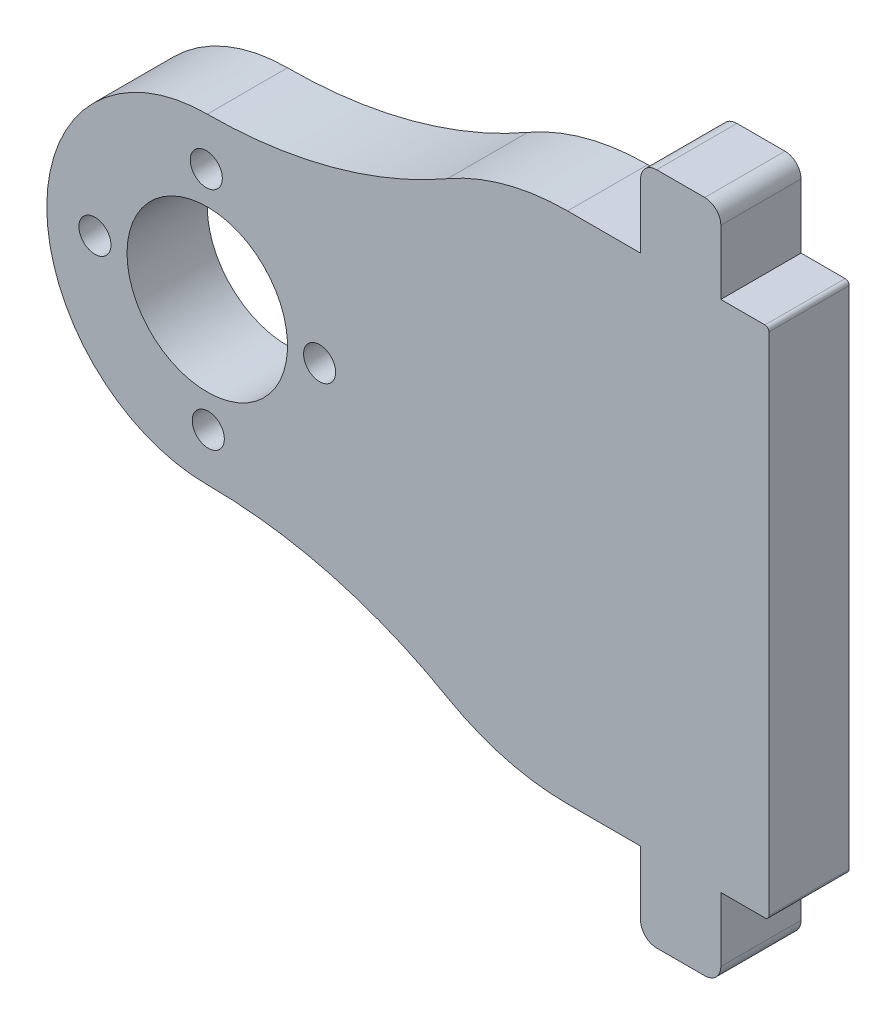
ISO-10303-21;
HEADER;
FILE_DESCRIPTION(('STEP AP214'),'2;1');
FILE_NAME('part.step','',(''),(''),'','','');
FILE_SCHEMA(('AUTOMOTIVE_DESIGN { 1 0 10303 214 1 1 1 1 }'));
ENDSEC;
DATA;
#1=APPLICATION_CONTEXT('core data for automotive mechanical design processes');
#2=APPLICATION_PROTOCOL_DEFINITION('international standard','automotive_design',2000,#1);
#3=PRODUCT_CONTEXT('',#1,'mechanical');
#4=PRODUCT('Part','Part','',(#3));
#5=PRODUCT_RELATED_PRODUCT_CATEGORY('part','',(#4));
#6=PRODUCT_DEFINITION_FORMATION('','',#4);
#7=PRODUCT_DEFINITION_CONTEXT('part definition',#1,'design');
#8=PRODUCT_DEFINITION('design','',#6,#7);
#9=PRODUCT_DEFINITION_SHAPE('','',#8);
#10=(LENGTH_UNIT() NAMED_UNIT(*) SI_UNIT(.MILLI.,.METRE.));
#11=(NAMED_UNIT(*) PLANE_ANGLE_UNIT() SI_UNIT($,.RADIAN.));
#12=(NAMED_UNIT(*) SI_UNIT($,.STERADIAN.) SOLID_ANGLE_UNIT());
#13=UNCERTAINTY_MEASURE_WITH_UNIT(LENGTH_MEASURE(1.E-05),#10,'distance_accuracy_value','');
#14=(GEOMETRIC_REPRESENTATION_CONTEXT(3) GLOBAL_UNCERTAINTY_ASSIGNED_CONTEXT((#13)) GLOBAL_UNIT_ASSIGNED_CONTEXT((#10,
#11,#12)) REPRESENTATION_CONTEXT('',''));
#15=CARTESIAN_POINT('',(0.,0.,0.));
#16=DIRECTION('',(0.,0.,1.));
#17=DIRECTION('',(1.,0.,0.));
#18=AXIS2_PLACEMENT_3D('',#15,#16,#17);
#19=CARTESIAN_POINT('',(-12.5,40.,5.));
#20=DIRECTION('',(0.,0.,1.));
#21=DIRECTION('',(1.,0.,0.));
#22=AXIS2_PLACEMENT_3D('',#19,#20,#21);
#23=PLANE('',#22);
#24=DIRECTION('',(1.,0.,0.));
#25=VECTOR('',#24,1.);
#26=CARTESIAN_POINT('',(19.25,-21.,5.));
#27=LINE('',#26,#25);
#28=CARTESIAN_POINT('',(15.5,-21.,5.));
#29=VERTEX_POINT('',#28);
#30=CARTESIAN_POINT('',(18.5,-21.,5.));
#31=VERTEX_POINT('',#30);
#32=EDGE_CURVE('E261',#29,#31,#27,.T.);
#33=ORIENTED_EDGE('',*,*,#32,.T.);
#34=CARTESIAN_POINT('',(18.5,-20.,5.));
#35=DIRECTION('',(0.,0.,1.));
#36=DIRECTION('',(1.,0.,0.));
#37=AXIS2_PLACEMENT_3D('',#34,#35,#36);
#38=CIRCLE('',#37,1.);
#39=CARTESIAN_POINT('',(19.5,-20.,5.));
#40=VERTEX_POINT('',#39);
#41=EDGE_CURVE('E372',#31,#40,#38,.T.);
#42=ORIENTED_EDGE('',*,*,#41,.T.);
#43=DIRECTION('',(0.,1.,0.));
#44=VECTOR('',#43,1.);
#45=CARTESIAN_POINT('',(19.5,-16.25,5.));
#46=LINE('',#45,#44);
#47=CARTESIAN_POINT('',(19.5,-16.,5.));
#48=VERTEX_POINT('',#47);
#49=EDGE_CURVE('E263',#40,#48,#46,.T.);
#50=ORIENTED_EDGE('',*,*,#49,.T.);
#51=DIRECTION('',(1.,0.,0.));
#52=VECTOR('',#51,1.);
#53=CARTESIAN_POINT('',(22.25,-16.,5.));
#54=LINE('',#53,#52);
#55=CARTESIAN_POINT('',(22.25,-16.,5.));
#56=VERTEX_POINT('',#55);
#57=EDGE_CURVE('E265',#48,#56,#54,.T.);
#58=ORIENTED_EDGE('',*,*,#57,.T.);
#59=CARTESIAN_POINT('',(22.25,-15.75,5.));
#60=DIRECTION('',(0.,0.,1.));
#61=DIRECTION('',(1.,0.,0.));
#62=AXIS2_PLACEMENT_3D('',#59,#60,#61);
#63=CIRCLE('',#62,0.25);
#64=CARTESIAN_POINT('',(22.5,-15.75,5.));
#65=VERTEX_POINT('',#64);
#66=EDGE_CURVE('E267',#56,#65,#63,.T.);
#67=ORIENTED_EDGE('',*,*,#66,.T.);
#68=DIRECTION('',(0.,1.,0.));
#69=VECTOR('',#68,1.);
#70=CARTESIAN_POINT('',(22.5,15.75,5.));
#71=LINE('',#70,#69);
#72=CARTESIAN_POINT('',(22.5,15.75,5.));
#73=VERTEX_POINT('',#72);
#74=EDGE_CURVE('E269',#65,#73,#71,.T.);
#75=ORIENTED_EDGE('',*,*,#74,.T.);
#76=CARTESIAN_POINT('',(22.25,15.75,5.));
#77=DIRECTION('',(0.,0.,1.));
#78=DIRECTION('',(1.,0.,0.));
#79=AXIS2_PLACEMENT_3D('',#76,#77,#78);
#80=CIRCLE('',#79,0.25);
#81=CARTESIAN_POINT('',(22.25,16.,5.));
#82=VERTEX_POINT('',#81);
#83=EDGE_CURVE('E193',#73,#82,#80,.T.);
#84=ORIENTED_EDGE('',*,*,#83,.T.);
#85=DIRECTION('',(-1.,0.,0.));
#86=VECTOR('',#85,1.);
#87=CARTESIAN_POINT('',(19.75,16.,5.));
#88=LINE('',#87,#86);
#89=CARTESIAN_POINT('',(19.5,16.,5.));
#90=VERTEX_POINT('',#89);
#91=EDGE_CURVE('E186',#82,#90,#88,.T.);
#92=ORIENTED_EDGE('',*,*,#91,.T.);
#93=DIRECTION('',(0.,1.,0.));
#94=VECTOR('',#93,1.);
#95=CARTESIAN_POINT('',(19.5,20.75,5.));
#96=LINE('',#95,#94);
#97=CARTESIAN_POINT('',(19.5,20.,5.));
#98=VERTEX_POINT('',#97);
#99=EDGE_CURVE('E190',#90,#98,#96,.T.);
#100=ORIENTED_EDGE('',*,*,#99,.T.);
#101=CARTESIAN_POINT('',(18.5,20.,5.));
#102=DIRECTION('',(0.,0.,1.));
#103=DIRECTION('',(1.,0.,0.));
#104=AXIS2_PLACEMENT_3D('',#101,#102,#103);
#105=CIRCLE('',#104,1.);
#106=CARTESIAN_POINT('',(18.5,21.,5.));
#107=VERTEX_POINT('',#106);
#108=EDGE_CURVE('E368',#98,#107,#105,.T.);
#109=ORIENTED_EDGE('',*,*,#108,.T.);
#110=DIRECTION('',(-1.,0.,0.));
#111=VECTOR('',#110,1.);
#112=CARTESIAN_POINT('',(14.5,21.,5.));
#113=LINE('',#112,#111);
#114=CARTESIAN_POINT('',(15.5,21.,5.));
#115=VERTEX_POINT('',#114);
#116=EDGE_CURVE('E205',#107,#115,#113,.T.);
#117=ORIENTED_EDGE('',*,*,#116,.T.);
#118=CARTESIAN_POINT('',(15.5,20.,5.));
#119=DIRECTION('',(0.,0.,1.));
#120=DIRECTION('',(1.,0.,0.));
#121=AXIS2_PLACEMENT_3D('',#118,#119,#120);
#122=CIRCLE('',#121,1.);
#123=CARTESIAN_POINT('',(14.5,20.,5.));
#124=VERTEX_POINT('',#123);
#125=EDGE_CURVE('E58',#115,#124,#122,.T.);
#126=ORIENTED_EDGE('',*,*,#125,.T.);
#127=DIRECTION('',(0.,-1.,0.));
#128=VECTOR('',#127,1.);
#129=CARTESIAN_POINT('',(14.5,16.,5.));
#130=LINE('',#129,#128);
#131=CARTESIAN_POINT('',(14.5,16.,5.));
#132=VERTEX_POINT('',#131);
#133=EDGE_CURVE('E273',#124,#132,#130,.T.);
#134=ORIENTED_EDGE('',*,*,#133,.T.);
#135=DIRECTION('',(-1.,0.,0.));
#136=VECTOR('',#135,1.);
#137=CARTESIAN_POINT('',(13.4071794233524,16.,5.));
#138=LINE('',#137,#136);
#139=CARTESIAN_POINT('',(9.94994432064366,16.,5.));
#140=VERTEX_POINT('',#139);
#141=EDGE_CURVE('E275',#132,#140,#138,.T.);
#142=ORIENTED_EDGE('',*,*,#141,.T.);
#143=CARTESIAN_POINT('',(9.94994432064366,1.,5.));
#144=DIRECTION('',(0.,0.,1.));
#145=DIRECTION('',(1.,0.,0.));
#146=AXIS2_PLACEMENT_3D('',#143,#144,#145);
#147=CIRCLE('',#146,15.);
#148=CARTESIAN_POINT('',(2.46662954709578,14.,5.));
#149=VERTEX_POINT('',#148);
#150=EDGE_CURVE('E277',#140,#149,#147,.T.);
#151=ORIENTED_EDGE('',*,*,#150,.T.);
#152=CARTESIAN_POINT('',(-12.5,40.,5.));
#153=DIRECTION('',(0.,0.,-1.));
#154=DIRECTION('',(1.,0.,0.));
#155=AXIS2_PLACEMENT_3D('',#152,#153,#154);
#156=CIRCLE('',#155,30.);
#157=CARTESIAN_POINT('',(-12.5,9.99999999999999,5.));
#158=VERTEX_POINT('',#157);
#159=EDGE_CURVE('E247',#149,#158,#156,.T.);
#160=ORIENTED_EDGE('',*,*,#159,.T.);
#161=CARTESIAN_POINT('',(-12.5,0.,5.));
#162=DIRECTION('',(0.,0.,1.));
#163=DIRECTION('',(1.,0.,0.));
#164=AXIS2_PLACEMENT_3D('',#161,#162,#163);
#165=CIRCLE('',#164,10.);
#166=CARTESIAN_POINT('',(-12.5,-10.,5.));
#167=VERTEX_POINT('',#166);
#168=EDGE_CURVE('E250',#158,#167,#165,.T.);
#169=ORIENTED_EDGE('',*,*,#168,.T.);
#170=CARTESIAN_POINT('',(-12.5,-40.,5.));
#171=DIRECTION('',(0.,0.,-1.));
#172=DIRECTION('',(1.,0.,0.));
#173=AXIS2_PLACEMENT_3D('',#170,#171,#172);
#174=CIRCLE('',#173,30.);
#175=CARTESIAN_POINT('',(2.46662954709576,-14.,5.));
#176=VERTEX_POINT('',#175);
#177=EDGE_CURVE('E253',#167,#176,#174,.T.);
#178=ORIENTED_EDGE('',*,*,#177,.T.);
#179=CARTESIAN_POINT('',(9.94994432064363,-0.999999999999999,5.));
#180=DIRECTION('',(0.,0.,1.));
#181=DIRECTION('',(1.,0.,0.));
#182=AXIS2_PLACEMENT_3D('',#179,#180,#181);
#183=CIRCLE('',#182,15.);
#184=CARTESIAN_POINT('',(9.94994432064363,-16.,5.));
#185=VERTEX_POINT('',#184);
#186=EDGE_CURVE('E255',#176,#185,#183,.T.);
#187=ORIENTED_EDGE('',*,*,#186,.T.);
#188=DIRECTION('',(1.,0.,0.));
#189=VECTOR('',#188,1.);
#190=CARTESIAN_POINT('',(13.4071794233524,-16.,5.));
#191=LINE('',#190,#189);
#192=CARTESIAN_POINT('',(14.5,-16.,5.));
#193=VERTEX_POINT('',#192);
#194=EDGE_CURVE('E257',#185,#193,#191,.T.);
#195=ORIENTED_EDGE('',*,*,#194,.T.);
#196=DIRECTION('',(0.,-1.,0.));
#197=VECTOR('',#196,1.);
#198=CARTESIAN_POINT('',(14.5,-21.,5.));
#199=LINE('',#198,#197);
#200=CARTESIAN_POINT('',(14.5,-20.,5.));
#201=VERTEX_POINT('',#200);
#202=EDGE_CURVE('E259',#193,#201,#199,.T.);
#203=ORIENTED_EDGE('',*,*,#202,.T.);
#204=CARTESIAN_POINT('',(15.5,-20.,5.));
#205=DIRECTION('',(0.,0.,1.));
#206=DIRECTION('',(1.,0.,0.));
#207=AXIS2_PLACEMENT_3D('',#204,#205,#206);
#208=CIRCLE('',#207,1.);
#209=EDGE_CURVE('E370',#201,#29,#208,.T.);
#210=ORIENTED_EDGE('',*,*,#209,.T.);
#211=EDGE_LOOP('',(#33,#42,#50,#58,#67,#75,#84,#92,#100,#109,#117,#126,#134,#142,#151,#160,#169,
#178,#187,#195,#203,#210));
#212=FACE_BOUND('',#211,.T.);
#213=CARTESIAN_POINT('',(-12.5,0.,5.));
#214=DIRECTION('',(0.,0.,-1.));
#215=DIRECTION('',(-1.,0.,0.));
#216=AXIS2_PLACEMENT_3D('',#213,#214,#215);
#217=CIRCLE('',#216,5.);
#218=CARTESIAN_POINT('',(-17.5,0.,5.));
#219=VERTEX_POINT('',#218);
#220=EDGE_CURVE('E215',#219,#219,#217,.T.);
#221=ORIENTED_EDGE('',*,*,#220,.T.);
#222=EDGE_LOOP('',(#221));
#223=FACE_BOUND('',#222,.T.);
#224=CARTESIAN_POINT('',(-12.5624545754266,7.,5.));
#225=DIRECTION('',(0.,0.,1.));
#226=DIRECTION('',(1.,0.,0.));
#227=AXIS2_PLACEMENT_3D('',#224,#225,#226);
#228=CIRCLE('',#227,1.);
#229=CARTESIAN_POINT('',(-11.5624545754266,7.,5.));
#230=VERTEX_POINT('',#229);
#231=EDGE_CURVE('E235',#230,#230,#228,.T.);
#232=ORIENTED_EDGE('',*,*,#231,.F.);
#233=EDGE_LOOP('',(#232));
#234=FACE_BOUND('',#233,.T.);
#235=CARTESIAN_POINT('',(-19.5,-0.0624545754265818,5.));
#236=DIRECTION('',(0.,0.,1.));
#237=DIRECTION('',(1.,0.,0.));
#238=AXIS2_PLACEMENT_3D('',#235,#236,#237);
#239=CIRCLE('',#238,0.999999999999998);
#240=CARTESIAN_POINT('',(-18.5,-0.0624545754265818,5.));
#241=VERTEX_POINT('',#240);
#242=EDGE_CURVE('E241',#241,#241,#239,.T.);
#243=ORIENTED_EDGE('',*,*,#242,.F.);
#244=EDGE_LOOP('',(#243));
#245=FACE_BOUND('',#244,.T.);
#246=CARTESIAN_POINT('',(-5.5,0.0624545754265783,5.));
#247=DIRECTION('',(0.,0.,1.));
#248=DIRECTION('',(1.,0.,0.));
#249=AXIS2_PLACEMENT_3D('',#246,#247,#248);
#250=CIRCLE('',#249,1.);
#251=CARTESIAN_POINT('',(-4.5,0.0624545754265783,5.));
#252=VERTEX_POINT('',#251);
#253=EDGE_CURVE('E229',#252,#252,#250,.T.);
#254=ORIENTED_EDGE('',*,*,#253,.F.);
#255=EDGE_LOOP('',(#254));
#256=FACE_BOUND('',#255,.T.);
#257=CARTESIAN_POINT('',(-12.4375454245734,-7.,5.));
#258=DIRECTION('',(0.,0.,1.));
#259=DIRECTION('',(1.,0.,0.));
#260=AXIS2_PLACEMENT_3D('',#257,#258,#259);
#261=CIRCLE('',#260,0.999999999999998);
#262=CARTESIAN_POINT('',(-11.4375454245734,-7.,5.));
#263=VERTEX_POINT('',#262);
#264=EDGE_CURVE('E223',#263,#263,#261,.T.);
#265=ORIENTED_EDGE('',*,*,#264,.F.);
#266=EDGE_LOOP('',(#265));
#267=FACE_BOUND('',#266,.T.);
#268=ADVANCED_FACE('F35',(#212,#223,#234,#245,#256,#267),#23,.T.);
#269=CARTESIAN_POINT('',(-12.5,40.,0.));
#270=DIRECTION('',(0.,0.,1.));
#271=DIRECTION('',(1.,0.,0.));
#272=AXIS2_PLACEMENT_3D('',#269,#270,#271);
#273=PLANE('',#272);
#274=DIRECTION('',(0.,1.,0.));
#275=VECTOR('',#274,1.);
#276=CARTESIAN_POINT('',(19.5,-16.25,0.));
#277=LINE('',#276,#275);
#278=CARTESIAN_POINT('',(19.5,-20.,0.));
#279=VERTEX_POINT('',#278);
#280=CARTESIAN_POINT('',(19.5,-16.,0.));
#281=VERTEX_POINT('',#280);
#282=EDGE_CURVE('E296',#279,#281,#277,.T.);
#283=ORIENTED_EDGE('',*,*,#282,.F.);
#284=CARTESIAN_POINT('',(18.5,-20.,0.));
#285=DIRECTION('',(0.,0.,1.));
#286=DIRECTION('',(1.,0.,0.));
#287=AXIS2_PLACEMENT_3D('',#284,#285,#286);
#288=CIRCLE('',#287,1.);
#289=CARTESIAN_POINT('',(18.5,-21.,0.));
#290=VERTEX_POINT('',#289);
#291=EDGE_CURVE('E360',#279,#290,#288,.F.);
#292=ORIENTED_EDGE('',*,*,#291,.T.);
#293=DIRECTION('',(1.,0.,0.));
#294=VECTOR('',#293,1.);
#295=CARTESIAN_POINT('',(19.25,-21.,0.));
#296=LINE('',#295,#294);
#297=CARTESIAN_POINT('',(15.5,-21.,0.));
#298=VERTEX_POINT('',#297);
#299=EDGE_CURVE('E293',#298,#290,#296,.T.);
#300=ORIENTED_EDGE('',*,*,#299,.F.);
#301=CARTESIAN_POINT('',(15.5,-20.,0.));
#302=DIRECTION('',(0.,0.,1.));
#303=DIRECTION('',(1.,0.,0.));
#304=AXIS2_PLACEMENT_3D('',#301,#302,#303);
#305=CIRCLE('',#304,1.);
#306=CARTESIAN_POINT('',(14.5,-20.,0.));
#307=VERTEX_POINT('',#306);
#308=EDGE_CURVE('E358',#298,#307,#305,.F.);
#309=ORIENTED_EDGE('',*,*,#308,.T.);
#310=DIRECTION('',(0.,-1.,0.));
#311=VECTOR('',#310,1.);
#312=CARTESIAN_POINT('',(14.5,-21.,0.));
#313=LINE('',#312,#311);
#314=CARTESIAN_POINT('',(14.5,-16.,0.));
#315=VERTEX_POINT('',#314);
#316=EDGE_CURVE('E291',#315,#307,#313,.T.);
#317=ORIENTED_EDGE('',*,*,#316,.F.);
#318=DIRECTION('',(1.,0.,0.));
#319=VECTOR('',#318,1.);
#320=CARTESIAN_POINT('',(14.5,-16.,0.));
#321=LINE('',#320,#319);
#322=CARTESIAN_POINT('',(9.94994432064363,-16.,0.));
#323=VERTEX_POINT('',#322);
#324=EDGE_CURVE('E289',#323,#315,#321,.T.);
#325=ORIENTED_EDGE('',*,*,#324,.F.);
#326=CARTESIAN_POINT('',(9.94994432064363,-0.999999999999999,0.));
#327=DIRECTION('',(0.,0.,1.));
#328=DIRECTION('',(1.,0.,0.));
#329=AXIS2_PLACEMENT_3D('',#326,#327,#328);
#330=CIRCLE('',#329,15.);
#331=CARTESIAN_POINT('',(2.46662954709576,-14.,0.));
#332=VERTEX_POINT('',#331);
#333=EDGE_CURVE('E286',#332,#323,#330,.T.);
#334=ORIENTED_EDGE('',*,*,#333,.F.);
#335=CARTESIAN_POINT('',(-12.5,-40.,0.));
#336=DIRECTION('',(0.,0.,-1.));
#337=DIRECTION('',(1.,0.,0.));
#338=AXIS2_PLACEMENT_3D('',#335,#336,#337);
#339=CIRCLE('',#338,30.);
#340=CARTESIAN_POINT('',(-12.5,-10.,0.));
#341=VERTEX_POINT('',#340);
#342=EDGE_CURVE('E284',#341,#332,#339,.T.);
#343=ORIENTED_EDGE('',*,*,#342,.F.);
#344=CARTESIAN_POINT('',(-12.5,0.,0.));
#345=DIRECTION('',(0.,0.,1.));
#346=DIRECTION('',(1.,0.,0.));
#347=AXIS2_PLACEMENT_3D('',#344,#345,#346);
#348=CIRCLE('',#347,10.);
#349=CARTESIAN_POINT('',(-12.5,9.99999999999999,0.));
#350=VERTEX_POINT('',#349);
#351=EDGE_CURVE('E282',#350,#341,#348,.T.);
#352=ORIENTED_EDGE('',*,*,#351,.F.);
#353=CARTESIAN_POINT('',(-12.5,40.,0.));
#354=DIRECTION('',(0.,0.,-1.));
#355=DIRECTION('',(1.,0.,0.));
#356=AXIS2_PLACEMENT_3D('',#353,#354,#355);
#357=CIRCLE('',#356,30.);
#358=CARTESIAN_POINT('',(2.46662954709578,14.,0.));
#359=VERTEX_POINT('',#358);
#360=EDGE_CURVE('E244',#359,#350,#357,.T.);
#361=ORIENTED_EDGE('',*,*,#360,.F.);
#362=CARTESIAN_POINT('',(9.94994432064366,1.,0.));
#363=DIRECTION('',(0.,0.,1.));
#364=DIRECTION('',(1.,0.,0.));
#365=AXIS2_PLACEMENT_3D('',#362,#363,#364);
#366=CIRCLE('',#365,15.);
#367=CARTESIAN_POINT('',(9.94994432064366,16.,0.));
#368=VERTEX_POINT('',#367);
#369=EDGE_CURVE('E251',#368,#359,#366,.T.);
#370=ORIENTED_EDGE('',*,*,#369,.F.);
#371=DIRECTION('',(-1.,0.,0.));
#372=VECTOR('',#371,1.);
#373=CARTESIAN_POINT('',(9.94994432064366,16.,0.));
#374=LINE('',#373,#372);
#375=CARTESIAN_POINT('',(14.5,16.,0.));
#376=VERTEX_POINT('',#375);
#377=EDGE_CURVE('E314',#376,#368,#374,.T.);
#378=ORIENTED_EDGE('',*,*,#377,.F.);
#379=DIRECTION('',(0.,-1.,0.));
#380=VECTOR('',#379,1.);
#381=CARTESIAN_POINT('',(14.5,16.,0.));
#382=LINE('',#381,#380);
#383=CARTESIAN_POINT('',(14.5,20.,0.));
#384=VERTEX_POINT('',#383);
#385=EDGE_CURVE('E312',#384,#376,#382,.T.);
#386=ORIENTED_EDGE('',*,*,#385,.F.);
#387=CARTESIAN_POINT('',(15.5,20.,0.));
#388=DIRECTION('',(0.,0.,1.));
#389=DIRECTION('',(1.,0.,0.));
#390=AXIS2_PLACEMENT_3D('',#387,#388,#389);
#391=CIRCLE('',#390,1.);
#392=CARTESIAN_POINT('',(15.5,21.,0.));
#393=VERTEX_POINT('',#392);
#394=EDGE_CURVE('E354',#384,#393,#391,.F.);
#395=ORIENTED_EDGE('',*,*,#394,.T.);
#396=DIRECTION('',(-1.,0.,0.));
#397=VECTOR('',#396,1.);
#398=CARTESIAN_POINT('',(14.5,21.,0.));
#399=LINE('',#398,#397);
#400=CARTESIAN_POINT('',(18.5,21.,0.));
#401=VERTEX_POINT('',#400);
#402=EDGE_CURVE('E309',#401,#393,#399,.T.);
#403=ORIENTED_EDGE('',*,*,#402,.F.);
#404=CARTESIAN_POINT('',(18.5,20.,0.));
#405=DIRECTION('',(0.,0.,1.));
#406=DIRECTION('',(1.,0.,0.));
#407=AXIS2_PLACEMENT_3D('',#404,#405,#406);
#408=CIRCLE('',#407,1.);
#409=CARTESIAN_POINT('',(19.5,20.,0.));
#410=VERTEX_POINT('',#409);
#411=EDGE_CURVE('E356',#401,#410,#408,.F.);
#412=ORIENTED_EDGE('',*,*,#411,.T.);
#413=DIRECTION('',(0.,1.,0.));
#414=VECTOR('',#413,1.);
#415=CARTESIAN_POINT('',(19.5,20.75,0.));
#416=LINE('',#415,#414);
#417=CARTESIAN_POINT('',(19.5,16.,0.));
#418=VERTEX_POINT('',#417);
#419=EDGE_CURVE('E307',#418,#410,#416,.T.);
#420=ORIENTED_EDGE('',*,*,#419,.F.);
#421=DIRECTION('',(-1.,0.,0.));
#422=VECTOR('',#421,1.);
#423=CARTESIAN_POINT('',(19.75,16.,0.));
#424=LINE('',#423,#422);
#425=CARTESIAN_POINT('',(22.25,16.,0.));
#426=VERTEX_POINT('',#425);
#427=EDGE_CURVE('E209',#426,#418,#424,.T.);
#428=ORIENTED_EDGE('',*,*,#427,.F.);
#429=CARTESIAN_POINT('',(22.25,15.75,0.));
#430=DIRECTION('',(0.,0.,1.));
#431=DIRECTION('',(1.,0.,0.));
#432=AXIS2_PLACEMENT_3D('',#429,#430,#431);
#433=CIRCLE('',#432,0.25);
#434=CARTESIAN_POINT('',(22.5,15.75,0.));
#435=VERTEX_POINT('',#434);
#436=EDGE_CURVE('E304',#435,#426,#433,.T.);
#437=ORIENTED_EDGE('',*,*,#436,.F.);
#438=DIRECTION('',(0.,1.,0.));
#439=VECTOR('',#438,1.);
#440=CARTESIAN_POINT('',(22.5,15.75,0.));
#441=LINE('',#440,#439);
#442=CARTESIAN_POINT('',(22.5,-15.75,0.));
#443=VERTEX_POINT('',#442);
#444=EDGE_CURVE('E302',#443,#435,#441,.T.);
#445=ORIENTED_EDGE('',*,*,#444,.F.);
#446=CARTESIAN_POINT('',(22.25,-15.75,0.));
#447=DIRECTION('',(0.,0.,1.));
#448=DIRECTION('',(1.,0.,0.));
#449=AXIS2_PLACEMENT_3D('',#446,#447,#448);
#450=CIRCLE('',#449,0.25);
#451=CARTESIAN_POINT('',(22.25,-16.,0.));
#452=VERTEX_POINT('',#451);
#453=EDGE_CURVE('E300',#452,#443,#450,.T.);
#454=ORIENTED_EDGE('',*,*,#453,.F.);
#455=DIRECTION('',(1.,0.,0.));
#456=VECTOR('',#455,1.);
#457=CARTESIAN_POINT('',(22.25,-16.,0.));
#458=LINE('',#457,#456);
#459=EDGE_CURVE('E298',#281,#452,#458,.T.);
#460=ORIENTED_EDGE('',*,*,#459,.F.);
#461=EDGE_LOOP('',(#283,#292,#300,#309,#317,#325,#334,#343,#352,#361,#370,#378,#386,#395,#403,
#412,#420,#428,#437,#445,#454,#460));
#462=FACE_BOUND('',#461,.T.);
#463=CARTESIAN_POINT('',(-12.4375454245734,-7.,0.));
#464=DIRECTION('',(0.,0.,1.));
#465=DIRECTION('',(1.,0.,0.));
#466=AXIS2_PLACEMENT_3D('',#463,#464,#465);
#467=CIRCLE('',#466,0.999999999999998);
#468=CARTESIAN_POINT('',(-11.4375454245734,-7.,0.));
#469=VERTEX_POINT('',#468);
#470=EDGE_CURVE('E221',#469,#469,#467,.T.);
#471=ORIENTED_EDGE('',*,*,#470,.T.);
#472=EDGE_LOOP('',(#471));
#473=FACE_BOUND('',#472,.T.);
#474=CARTESIAN_POINT('',(-5.5,0.0624545754265783,0.));
#475=DIRECTION('',(0.,0.,1.));
#476=DIRECTION('',(1.,0.,0.));
#477=AXIS2_PLACEMENT_3D('',#474,#475,#476);
#478=CIRCLE('',#477,1.);
#479=CARTESIAN_POINT('',(-4.5,0.0624545754265783,0.));
#480=VERTEX_POINT('',#479);
#481=EDGE_CURVE('E226',#480,#480,#478,.T.);
#482=ORIENTED_EDGE('',*,*,#481,.T.);
#483=EDGE_LOOP('',(#482));
#484=FACE_BOUND('',#483,.T.);
#485=CARTESIAN_POINT('',(-12.5624545754266,7.,0.));
#486=DIRECTION('',(0.,0.,1.));
#487=DIRECTION('',(1.,0.,0.));
#488=AXIS2_PLACEMENT_3D('',#485,#486,#487);
#489=CIRCLE('',#488,1.);
#490=CARTESIAN_POINT('',(-11.5624545754266,7.,0.));
#491=VERTEX_POINT('',#490);
#492=EDGE_CURVE('E232',#491,#491,#489,.T.);
#493=ORIENTED_EDGE('',*,*,#492,.T.);
#494=EDGE_LOOP('',(#493));
#495=FACE_BOUND('',#494,.T.);
#496=CARTESIAN_POINT('',(-19.5,-0.0624545754265818,0.));
#497=DIRECTION('',(0.,0.,1.));
#498=DIRECTION('',(1.,0.,0.));
#499=AXIS2_PLACEMENT_3D('',#496,#497,#498);
#500=CIRCLE('',#499,0.999999999999998);
#501=CARTESIAN_POINT('',(-18.5,-0.0624545754265818,0.));
#502=VERTEX_POINT('',#501);
#503=EDGE_CURVE('E238',#502,#502,#500,.T.);
#504=ORIENTED_EDGE('',*,*,#503,.T.);
#505=EDGE_LOOP('',(#504));
#506=FACE_BOUND('',#505,.T.);
#507=CARTESIAN_POINT('',(-12.5,0.,0.));
#508=DIRECTION('',(0.,0.,-1.));
#509=DIRECTION('',(-1.,0.,0.));
#510=AXIS2_PLACEMENT_3D('',#507,#508,#509);
#511=CIRCLE('',#510,5.);
#512=CARTESIAN_POINT('',(-17.5,0.,0.));
#513=VERTEX_POINT('',#512);
#514=EDGE_CURVE('E211',#513,#513,#511,.T.);
#515=ORIENTED_EDGE('',*,*,#514,.F.);
#516=EDGE_LOOP('',(#515));
#517=FACE_BOUND('',#516,.T.);
#518=ADVANCED_FACE('F388',(#462,#473,#484,#495,#506,#517),#273,.F.);
#519=CARTESIAN_POINT('',(-12.5,40.,5.));
#520=DIRECTION('',(0.,0.,-1.));
#521=DIRECTION('',(-1.,0.,0.));
#522=AXIS2_PLACEMENT_3D('',#519,#520,#521);
#523=CYLINDRICAL_SURFACE('',#522,30.);
#524=ORIENTED_EDGE('',*,*,#360,.T.);
#525=DIRECTION('',(0.,0.,-1.));
#526=VECTOR('',#525,1.);
#527=CARTESIAN_POINT('',(-12.5,9.99999999999999,5.));
#528=LINE('',#527,#526);
#529=EDGE_CURVE('E348',#158,#350,#528,.T.);
#530=ORIENTED_EDGE('',*,*,#529,.F.);
#531=ORIENTED_EDGE('',*,*,#159,.F.);
#532=DIRECTION('',(0.,0.,-1.));
#533=VECTOR('',#532,1.);
#534=CARTESIAN_POINT('',(2.46662954709578,14.,5.));
#535=LINE('',#534,#533);
#536=EDGE_CURVE('E279',#149,#359,#535,.T.);
#537=ORIENTED_EDGE('',*,*,#536,.T.);
#538=EDGE_LOOP('',(#524,#530,#531,#537));
#539=FACE_BOUND('',#538,.T.);
#540=ADVANCED_FACE('F410',(#539),#523,.F.);
#541=CARTESIAN_POINT('',(-12.5,0.,5.));
#542=DIRECTION('',(0.,0.,-1.));
#543=DIRECTION('',(-1.,0.,0.));
#544=AXIS2_PLACEMENT_3D('',#541,#542,#543);
#545=CYLINDRICAL_SURFACE('',#544,10.);
#546=ORIENTED_EDGE('',*,*,#351,.T.);
#547=DIRECTION('',(0.,0.,-1.));
#548=VECTOR('',#547,1.);
#549=CARTESIAN_POINT('',(-12.5,-10.,5.));
#550=LINE('',#549,#548);
#551=EDGE_CURVE('E345',#167,#341,#550,.T.);
#552=ORIENTED_EDGE('',*,*,#551,.F.);
#553=ORIENTED_EDGE('',*,*,#168,.F.);
#554=ORIENTED_EDGE('',*,*,#529,.T.);
#555=EDGE_LOOP('',(#546,#552,#553,#554));
#556=FACE_BOUND('',#555,.T.);
#557=ADVANCED_FACE('F415',(#556),#545,.T.);
#558=CARTESIAN_POINT('',(-12.5,-40.,5.));
#559=DIRECTION('',(0.,0.,-1.));
#560=DIRECTION('',(-1.,0.,0.));
#561=AXIS2_PLACEMENT_3D('',#558,#559,#560);
#562=CYLINDRICAL_SURFACE('',#561,30.);
#563=ORIENTED_EDGE('',*,*,#342,.T.);
#564=DIRECTION('',(0.,0.,-1.));
#565=VECTOR('',#564,1.);
#566=CARTESIAN_POINT('',(2.46662954709576,-14.,5.));
#567=LINE('',#566,#565);
#568=EDGE_CURVE('E342',#176,#332,#567,.T.);
#569=ORIENTED_EDGE('',*,*,#568,.F.);
#570=ORIENTED_EDGE('',*,*,#177,.F.);
#571=ORIENTED_EDGE('',*,*,#551,.T.);
#572=EDGE_LOOP('',(#563,#569,#570,#571));
#573=FACE_BOUND('',#572,.T.);
#574=ADVANCED_FACE('F418',(#573),#562,.F.);
#575=CARTESIAN_POINT('',(9.94994432064363,-0.999999999999999,5.));
#576=DIRECTION('',(0.,0.,-1.));
#577=DIRECTION('',(-1.,0.,0.));
#578=AXIS2_PLACEMENT_3D('',#575,#576,#577);
#579=CYLINDRICAL_SURFACE('',#578,15.);
#580=ORIENTED_EDGE('',*,*,#333,.T.);
#581=DIRECTION('',(0.,0.,-1.));
#582=VECTOR('',#581,1.);
#583=CARTESIAN_POINT('',(9.94994432064363,-16.,5.));
#584=LINE('',#583,#582);
#585=EDGE_CURVE('E339',#185,#323,#584,.T.);
#586=ORIENTED_EDGE('',*,*,#585,.F.);
#587=ORIENTED_EDGE('',*,*,#186,.F.);
#588=ORIENTED_EDGE('',*,*,#568,.T.);
#589=EDGE_LOOP('',(#580,#586,#587,#588));
#590=FACE_BOUND('',#589,.T.);
#591=ADVANCED_FACE('F423',(#590),#579,.T.);
#592=CARTESIAN_POINT('',(14.5,-16.,5.));
#593=DIRECTION('',(0.,1.,0.));
#594=DIRECTION('',(0.,0.,1.));
#595=AXIS2_PLACEMENT_3D('',#592,#593,#594);
#596=PLANE('',#595);
#597=ORIENTED_EDGE('',*,*,#324,.T.);
#598=DIRECTION('',(0.,0.,-1.));
#599=VECTOR('',#598,1.);
#600=CARTESIAN_POINT('',(14.5,-16.,5.));
#601=LINE('',#600,#599);
#602=EDGE_CURVE('E336',#193,#315,#601,.T.);
#603=ORIENTED_EDGE('',*,*,#602,.F.);
#604=ORIENTED_EDGE('',*,*,#194,.F.);
#605=ORIENTED_EDGE('',*,*,#585,.T.);
#606=EDGE_LOOP('',(#597,#603,#604,#605));
#607=FACE_BOUND('',#606,.T.);
#608=ADVANCED_FACE('F428',(#607),#596,.F.);
#609=CARTESIAN_POINT('',(14.5,-21.,5.));
#610=DIRECTION('',(1.,0.,0.));
#611=DIRECTION('',(0.,0.,-1.));
#612=AXIS2_PLACEMENT_3D('',#609,#610,#611);
#613=PLANE('',#612);
#614=ORIENTED_EDGE('',*,*,#316,.T.);
#615=DIRECTION('',(0.,0.,-1.));
#616=VECTOR('',#615,1.);
#617=CARTESIAN_POINT('',(14.5,-20.,5.));
#618=LINE('',#617,#616);
#619=EDGE_CURVE('E50',#307,#201,#618,.F.);
#620=ORIENTED_EDGE('',*,*,#619,.T.);
#621=ORIENTED_EDGE('',*,*,#202,.F.);
#622=ORIENTED_EDGE('',*,*,#602,.T.);
#623=EDGE_LOOP('',(#614,#620,#621,#622));
#624=FACE_BOUND('',#623,.T.);
#625=ADVANCED_FACE('F430',(#624),#613,.F.);
#626=CARTESIAN_POINT('',(19.25,-21.,5.));
#627=DIRECTION('',(0.,1.,0.));
#628=DIRECTION('',(0.,0.,1.));
#629=AXIS2_PLACEMENT_3D('',#626,#627,#628);
#630=PLANE('',#629);
#631=ORIENTED_EDGE('',*,*,#299,.T.);
#632=DIRECTION('',(0.,0.,-1.));
#633=VECTOR('',#632,1.);
#634=CARTESIAN_POINT('',(18.5,-21.,5.));
#635=LINE('',#634,#633);
#636=EDGE_CURVE('E365',#290,#31,#635,.F.);
#637=ORIENTED_EDGE('',*,*,#636,.T.);
#638=ORIENTED_EDGE('',*,*,#32,.F.);
#639=DIRECTION('',(0.,0.,-1.));
#640=VECTOR('',#639,1.);
#641=CARTESIAN_POINT('',(15.5,-21.,5.));
#642=LINE('',#641,#640);
#643=EDGE_CURVE('E362',#29,#298,#642,.T.);
#644=ORIENTED_EDGE('',*,*,#643,.T.);
#645=EDGE_LOOP('',(#631,#637,#638,#644));
#646=FACE_BOUND('',#645,.T.);
#647=ADVANCED_FACE('F432',(#646),#630,.F.);
#648=CARTESIAN_POINT('',(19.5,-16.25,5.));
#649=DIRECTION('',(-1.,0.,0.));
#650=DIRECTION('',(0.,0.,1.));
#651=AXIS2_PLACEMENT_3D('',#648,#649,#650);
#652=PLANE('',#651);
#653=ORIENTED_EDGE('',*,*,#49,.F.);
#654=DIRECTION('',(0.,0.,-1.));
#655=VECTOR('',#654,1.);
#656=CARTESIAN_POINT('',(19.5,-20.,5.));
#657=LINE('',#656,#655);
#658=EDGE_CURVE('E351',#40,#279,#657,.T.);
#659=ORIENTED_EDGE('',*,*,#658,.T.);
#660=ORIENTED_EDGE('',*,*,#282,.T.);
#661=DIRECTION('',(0.,0.,-1.));
#662=VECTOR('',#661,1.);
#663=CARTESIAN_POINT('',(19.5,-16.,5.));
#664=LINE('',#663,#662);
#665=EDGE_CURVE('E212',#48,#281,#664,.T.);
#666=ORIENTED_EDGE('',*,*,#665,.F.);
#667=EDGE_LOOP('',(#653,#659,#660,#666));
#668=FACE_BOUND('',#667,.T.);
#669=ADVANCED_FACE('F438',(#668),#652,.F.);
#670=CARTESIAN_POINT('',(22.25,-16.,5.));
#671=DIRECTION('',(0.,1.,0.));
#672=DIRECTION('',(0.,0.,1.));
#673=AXIS2_PLACEMENT_3D('',#670,#671,#672);
#674=PLANE('',#673);
#675=ORIENTED_EDGE('',*,*,#459,.T.);
#676=DIRECTION('',(0.,0.,-1.));
#677=VECTOR('',#676,1.);
#678=CARTESIAN_POINT('',(22.25,-16.,5.));
#679=LINE('',#678,#677);
#680=EDGE_CURVE('E333',#56,#452,#679,.T.);
#681=ORIENTED_EDGE('',*,*,#680,.F.);
#682=ORIENTED_EDGE('',*,*,#57,.F.);
#683=ORIENTED_EDGE('',*,*,#665,.T.);
#684=EDGE_LOOP('',(#675,#681,#682,#683));
#685=FACE_BOUND('',#684,.T.);
#686=ADVANCED_FACE('F475',(#685),#674,.F.);
#687=CARTESIAN_POINT('',(22.25,-15.75,5.));
#688=DIRECTION('',(0.,0.,-1.));
#689=DIRECTION('',(-1.,0.,0.));
#690=AXIS2_PLACEMENT_3D('',#687,#688,#689);
#691=CYLINDRICAL_SURFACE('',#690,0.25);
#692=ORIENTED_EDGE('',*,*,#453,.T.);
#693=DIRECTION('',(0.,0.,-1.));
#694=VECTOR('',#693,1.);
#695=CARTESIAN_POINT('',(22.5,-15.75,5.));
#696=LINE('',#695,#694);
#697=EDGE_CURVE('E330',#65,#443,#696,.T.);
#698=ORIENTED_EDGE('',*,*,#697,.F.);
#699=ORIENTED_EDGE('',*,*,#66,.F.);
#700=ORIENTED_EDGE('',*,*,#680,.T.);
#701=EDGE_LOOP('',(#692,#698,#699,#700));
#702=FACE_BOUND('',#701,.T.);
#703=ADVANCED_FACE('F471',(#702),#691,.T.);
#704=CARTESIAN_POINT('',(22.5,15.75,5.));
#705=DIRECTION('',(-1.,0.,0.));
#706=DIRECTION('',(0.,-1.,0.));
#707=AXIS2_PLACEMENT_3D('',#704,#705,#706);
#708=PLANE('',#707);
#709=ORIENTED_EDGE('',*,*,#444,.T.);
#710=DIRECTION('',(0.,0.,-1.));
#711=VECTOR('',#710,1.);
#712=CARTESIAN_POINT('',(22.5,15.75,5.));
#713=LINE('',#712,#711);
#714=EDGE_CURVE('E327',#73,#435,#713,.T.);
#715=ORIENTED_EDGE('',*,*,#714,.F.);
#716=ORIENTED_EDGE('',*,*,#74,.F.);
#717=ORIENTED_EDGE('',*,*,#697,.T.);
#718=EDGE_LOOP('',(#709,#715,#716,#717));
#719=FACE_BOUND('',#718,.T.);
#720=ADVANCED_FACE('F467',(#719),#708,.F.);
#721=CARTESIAN_POINT('',(22.25,15.75,5.));
#722=DIRECTION('',(0.,0.,-1.));
#723=DIRECTION('',(-1.,0.,0.));
#724=AXIS2_PLACEMENT_3D('',#721,#722,#723);
#725=CYLINDRICAL_SURFACE('',#724,0.25);
#726=ORIENTED_EDGE('',*,*,#436,.T.);
#727=DIRECTION('',(0.,0.,-1.));
#728=VECTOR('',#727,1.);
#729=CARTESIAN_POINT('',(22.25,16.,5.));
#730=LINE('',#729,#728);
#731=EDGE_CURVE('E325',#82,#426,#730,.T.);
#732=ORIENTED_EDGE('',*,*,#731,.F.);
#733=ORIENTED_EDGE('',*,*,#83,.F.);
#734=ORIENTED_EDGE('',*,*,#714,.T.);
#735=EDGE_LOOP('',(#726,#732,#733,#734));
#736=FACE_BOUND('',#735,.T.);
#737=ADVANCED_FACE('F464',(#736),#725,.T.);
#738=CARTESIAN_POINT('',(19.75,16.,5.));
#739=DIRECTION('',(0.,-1.,0.));
#740=DIRECTION('',(0.,0.,-1.));
#741=AXIS2_PLACEMENT_3D('',#738,#739,#740);
#742=PLANE('',#741);
#743=ORIENTED_EDGE('',*,*,#427,.T.);
#744=DIRECTION('',(0.,0.,-1.));
#745=VECTOR('',#744,1.);
#746=CARTESIAN_POINT('',(19.5,16.,5.));
#747=LINE('',#746,#745);
#748=EDGE_CURVE('E203',#90,#418,#747,.T.);
#749=ORIENTED_EDGE('',*,*,#748,.F.);
#750=ORIENTED_EDGE('',*,*,#91,.F.);
#751=ORIENTED_EDGE('',*,*,#731,.T.);
#752=EDGE_LOOP('',(#743,#749,#750,#751));
#753=FACE_BOUND('',#752,.T.);
#754=ADVANCED_FACE('F207',(#753),#742,.F.);
#755=CARTESIAN_POINT('',(19.5,20.75,5.));
#756=DIRECTION('',(-1.,0.,0.));
#757=DIRECTION('',(0.,0.,1.));
#758=AXIS2_PLACEMENT_3D('',#755,#756,#757);
#759=PLANE('',#758);
#760=ORIENTED_EDGE('',*,*,#419,.T.);
#761=DIRECTION('',(0.,0.,-1.));
#762=VECTOR('',#761,1.);
#763=CARTESIAN_POINT('',(19.5,20.,5.));
#764=LINE('',#763,#762);
#765=EDGE_CURVE('E43',#410,#98,#764,.F.);
#766=ORIENTED_EDGE('',*,*,#765,.T.);
#767=ORIENTED_EDGE('',*,*,#99,.F.);
#768=ORIENTED_EDGE('',*,*,#748,.T.);
#769=EDGE_LOOP('',(#760,#766,#767,#768));
#770=FACE_BOUND('',#769,.T.);
#771=ADVANCED_FACE('F202',(#770),#759,.F.);
#772=CARTESIAN_POINT('',(14.5,21.,5.));
#773=DIRECTION('',(0.,-1.,0.));
#774=DIRECTION('',(0.,0.,-1.));
#775=AXIS2_PLACEMENT_3D('',#772,#773,#774);
#776=PLANE('',#775);
#777=ORIENTED_EDGE('',*,*,#116,.F.);
#778=DIRECTION('',(0.,0.,-1.));
#779=VECTOR('',#778,1.);
#780=CARTESIAN_POINT('',(18.5,21.,5.));
#781=LINE('',#780,#779);
#782=EDGE_CURVE('E377',#107,#401,#781,.T.);
#783=ORIENTED_EDGE('',*,*,#782,.T.);
#784=ORIENTED_EDGE('',*,*,#402,.T.);
#785=DIRECTION('',(0.,0.,-1.));
#786=VECTOR('',#785,1.);
#787=CARTESIAN_POINT('',(15.5,21.,5.));
#788=LINE('',#787,#786);
#789=EDGE_CURVE('E375',#393,#115,#788,.F.);
#790=ORIENTED_EDGE('',*,*,#789,.T.);
#791=EDGE_LOOP('',(#777,#783,#784,#790));
#792=FACE_BOUND('',#791,.T.);
#793=ADVANCED_FACE('F383',(#792),#776,.F.);
#794=CARTESIAN_POINT('',(14.5,16.,5.));
#795=DIRECTION('',(1.,0.,0.));
#796=DIRECTION('',(0.,0.,-1.));
#797=AXIS2_PLACEMENT_3D('',#794,#795,#796);
#798=PLANE('',#797);
#799=ORIENTED_EDGE('',*,*,#133,.F.);
#800=DIRECTION('',(0.,0.,-1.));
#801=VECTOR('',#800,1.);
#802=CARTESIAN_POINT('',(14.5,20.,5.));
#803=LINE('',#802,#801);
#804=EDGE_CURVE('E11',#124,#384,#803,.T.);
#805=ORIENTED_EDGE('',*,*,#804,.T.);
#806=ORIENTED_EDGE('',*,*,#385,.T.);
#807=DIRECTION('',(0.,0.,-1.));
#808=VECTOR('',#807,1.);
#809=CARTESIAN_POINT('',(14.5,16.,5.));
#810=LINE('',#809,#808);
#811=EDGE_CURVE('E322',#132,#376,#810,.T.);
#812=ORIENTED_EDGE('',*,*,#811,.F.);
#813=EDGE_LOOP('',(#799,#805,#806,#812));
#814=FACE_BOUND('',#813,.T.);
#815=ADVANCED_FACE('F395',(#814),#798,.F.);
#816=CARTESIAN_POINT('',(9.94994432064366,16.,5.));
#817=DIRECTION('',(0.,-1.,0.));
#818=DIRECTION('',(0.,0.,-1.));
#819=AXIS2_PLACEMENT_3D('',#816,#817,#818);
#820=PLANE('',#819);
#821=ORIENTED_EDGE('',*,*,#377,.T.);
#822=DIRECTION('',(0.,0.,-1.));
#823=VECTOR('',#822,1.);
#824=CARTESIAN_POINT('',(9.94994432064366,16.,5.));
#825=LINE('',#824,#823);
#826=EDGE_CURVE('E319',#140,#368,#825,.T.);
#827=ORIENTED_EDGE('',*,*,#826,.F.);
#828=ORIENTED_EDGE('',*,*,#141,.F.);
#829=ORIENTED_EDGE('',*,*,#811,.T.);
#830=EDGE_LOOP('',(#821,#827,#828,#829));
#831=FACE_BOUND('',#830,.T.);
#832=ADVANCED_FACE('F402',(#831),#820,.F.);
#833=CARTESIAN_POINT('',(9.94994432064366,1.,5.));
#834=DIRECTION('',(0.,0.,-1.));
#835=DIRECTION('',(-1.,0.,0.));
#836=AXIS2_PLACEMENT_3D('',#833,#834,#835);
#837=CYLINDRICAL_SURFACE('',#836,15.);
#838=ORIENTED_EDGE('',*,*,#369,.T.);
#839=ORIENTED_EDGE('',*,*,#536,.F.);
#840=ORIENTED_EDGE('',*,*,#150,.F.);
#841=ORIENTED_EDGE('',*,*,#826,.T.);
#842=EDGE_LOOP('',(#838,#839,#840,#841));
#843=FACE_BOUND('',#842,.T.);
#844=ADVANCED_FACE('F405',(#843),#837,.T.);
#845=CARTESIAN_POINT('',(-19.5,-0.0624545754265818,5.));
#846=DIRECTION('',(0.,0.,-1.));
#847=DIRECTION('',(-1.,0.,0.));
#848=AXIS2_PLACEMENT_3D('',#845,#846,#847);
#849=CYLINDRICAL_SURFACE('',#848,0.999999999999998);
#850=ORIENTED_EDGE('',*,*,#242,.T.);
#851=EDGE_LOOP('',(#850));
#852=FACE_BOUND('',#851,.T.);
#853=ORIENTED_EDGE('',*,*,#503,.F.);
#854=EDGE_LOOP('',(#853));
#855=FACE_BOUND('',#854,.T.);
#856=ADVANCED_FACE('F449',(#852,#855),#849,.F.);
#857=CARTESIAN_POINT('',(-12.5624545754266,7.,5.));
#858=DIRECTION('',(0.,0.,-1.));
#859=DIRECTION('',(-1.,0.,0.));
#860=AXIS2_PLACEMENT_3D('',#857,#858,#859);
#861=CYLINDRICAL_SURFACE('',#860,1.);
#862=ORIENTED_EDGE('',*,*,#231,.T.);
#863=EDGE_LOOP('',(#862));
#864=FACE_BOUND('',#863,.T.);
#865=ORIENTED_EDGE('',*,*,#492,.F.);
#866=EDGE_LOOP('',(#865));
#867=FACE_BOUND('',#866,.T.);
#868=ADVANCED_FACE('F567',(#864,#867),#861,.F.);
#869=CARTESIAN_POINT('',(-5.5,0.0624545754265783,5.));
#870=DIRECTION('',(0.,0.,-1.));
#871=DIRECTION('',(-1.,0.,0.));
#872=AXIS2_PLACEMENT_3D('',#869,#870,#871);
#873=CYLINDRICAL_SURFACE('',#872,1.);
#874=ORIENTED_EDGE('',*,*,#253,.T.);
#875=EDGE_LOOP('',(#874));
#876=FACE_BOUND('',#875,.T.);
#877=ORIENTED_EDGE('',*,*,#481,.F.);
#878=EDGE_LOOP('',(#877));
#879=FACE_BOUND('',#878,.T.);
#880=ADVANCED_FACE('F576',(#876,#879),#873,.F.);
#881=CARTESIAN_POINT('',(-12.4375454245734,-7.,5.));
#882=DIRECTION('',(0.,0.,-1.));
#883=DIRECTION('',(-1.,0.,0.));
#884=AXIS2_PLACEMENT_3D('',#881,#882,#883);
#885=CYLINDRICAL_SURFACE('',#884,0.999999999999998);
#886=ORIENTED_EDGE('',*,*,#264,.T.);
#887=EDGE_LOOP('',(#886));
#888=FACE_BOUND('',#887,.T.);
#889=ORIENTED_EDGE('',*,*,#470,.F.);
#890=EDGE_LOOP('',(#889));
#891=FACE_BOUND('',#890,.T.);
#892=ADVANCED_FACE('F585',(#888,#891),#885,.F.);
#893=CARTESIAN_POINT('',(-12.5,0.,5.));
#894=DIRECTION('',(0.,0.,-1.));
#895=DIRECTION('',(-1.,0.,0.));
#896=AXIS2_PLACEMENT_3D('',#893,#894,#895);
#897=CYLINDRICAL_SURFACE('',#896,5.);
#898=ORIENTED_EDGE('',*,*,#220,.F.);
#899=EDGE_LOOP('',(#898));
#900=FACE_BOUND('',#899,.T.);
#901=ORIENTED_EDGE('',*,*,#514,.T.);
#902=EDGE_LOOP('',(#901));
#903=FACE_BOUND('',#902,.T.);
#904=ADVANCED_FACE('F505',(#900,#903),#897,.F.);
#905=CARTESIAN_POINT('',(18.5,-20.,5.));
#906=DIRECTION('',(0.,0.,-1.));
#907=DIRECTION('',(-1.,0.,0.));
#908=AXIS2_PLACEMENT_3D('',#905,#906,#907);
#909=CYLINDRICAL_SURFACE('',#908,1.);
#910=ORIENTED_EDGE('',*,*,#41,.F.);
#911=ORIENTED_EDGE('',*,*,#636,.F.);
#912=ORIENTED_EDGE('',*,*,#291,.F.);
#913=ORIENTED_EDGE('',*,*,#658,.F.);
#914=EDGE_LOOP('',(#910,#911,#912,#913));
#915=FACE_BOUND('',#914,.T.);
#916=ADVANCED_FACE('F490',(#915),#909,.T.);
#917=CARTESIAN_POINT('',(15.5,-20.,5.));
#918=DIRECTION('',(0.,0.,-1.));
#919=DIRECTION('',(-1.,0.,0.));
#920=AXIS2_PLACEMENT_3D('',#917,#918,#919);
#921=CYLINDRICAL_SURFACE('',#920,1.);
#922=ORIENTED_EDGE('',*,*,#209,.F.);
#923=ORIENTED_EDGE('',*,*,#619,.F.);
#924=ORIENTED_EDGE('',*,*,#308,.F.);
#925=ORIENTED_EDGE('',*,*,#643,.F.);
#926=EDGE_LOOP('',(#922,#923,#924,#925));
#927=FACE_BOUND('',#926,.T.);
#928=ADVANCED_FACE('F497',(#927),#921,.T.);
#929=CARTESIAN_POINT('',(18.5,20.,5.));
#930=DIRECTION('',(0.,0.,-1.));
#931=DIRECTION('',(-1.,0.,0.));
#932=AXIS2_PLACEMENT_3D('',#929,#930,#931);
#933=CYLINDRICAL_SURFACE('',#932,1.);
#934=ORIENTED_EDGE('',*,*,#108,.F.);
#935=ORIENTED_EDGE('',*,*,#765,.F.);
#936=ORIENTED_EDGE('',*,*,#411,.F.);
#937=ORIENTED_EDGE('',*,*,#782,.F.);
#938=EDGE_LOOP('',(#934,#935,#936,#937));
#939=FACE_BOUND('',#938,.T.);
#940=ADVANCED_FACE('F499',(#939),#933,.T.);
#941=CARTESIAN_POINT('',(15.5,20.,5.));
#942=DIRECTION('',(0.,0.,-1.));
#943=DIRECTION('',(-1.,0.,0.));
#944=AXIS2_PLACEMENT_3D('',#941,#942,#943);
#945=CYLINDRICAL_SURFACE('',#944,1.);
#946=ORIENTED_EDGE('',*,*,#125,.F.);
#947=ORIENTED_EDGE('',*,*,#789,.F.);
#948=ORIENTED_EDGE('',*,*,#394,.F.);
#949=ORIENTED_EDGE('',*,*,#804,.F.);
#950=EDGE_LOOP('',(#946,#947,#948,#949));
#951=FACE_BOUND('',#950,.T.);
#952=ADVANCED_FACE('F37',(#951),#945,.T.);
#953=CLOSED_SHELL('',(#268,#518,#540,#557,#574,#591,#608,#625,#647,#669,#686,#703,#720,#737,
#754,#771,#793,#815,#832,#844,#856,#868,#880,#892,#904,#916,#928,#940,#952));
#954=MANIFOLD_SOLID_BREP('B2',#953);
#955=ADVANCED_BREP_SHAPE_REPRESENTATION('',(#18,#954),#14);
#956=SHAPE_DEFINITION_REPRESENTATION(#9,#955);
ENDSEC;
END-ISO-10303-21;
